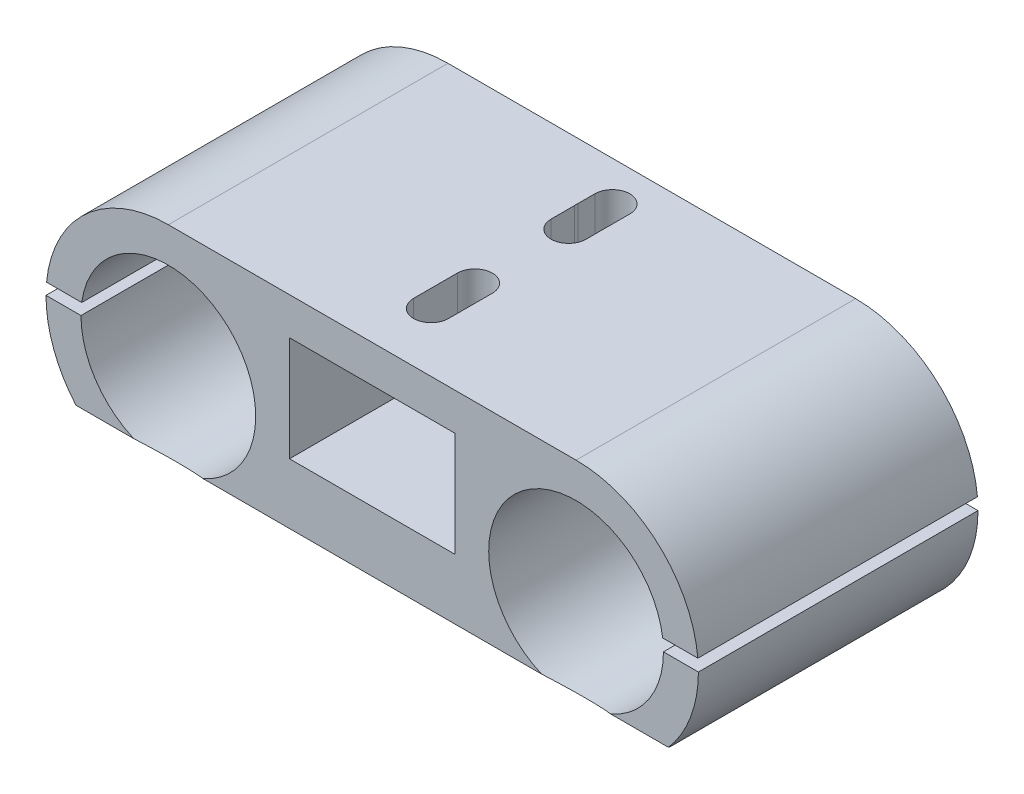
ISO-10303-21;
HEADER;
FILE_DESCRIPTION(('STEP AP214'),'2;1');
FILE_NAME('part.step','',(''),(''),'','','');
FILE_SCHEMA(('AUTOMOTIVE_DESIGN { 1 0 10303 214 1 1 1 1 }'));
ENDSEC;
DATA;
#1=APPLICATION_CONTEXT('core data for automotive mechanical design processes');
#2=APPLICATION_PROTOCOL_DEFINITION('international standard','automotive_design',2000,#1);
#3=PRODUCT_CONTEXT('',#1,'mechanical');
#4=PRODUCT('Part','Part','',(#3));
#5=PRODUCT_RELATED_PRODUCT_CATEGORY('part','',(#4));
#6=PRODUCT_DEFINITION_FORMATION('','',#4);
#7=PRODUCT_DEFINITION_CONTEXT('part definition',#1,'design');
#8=PRODUCT_DEFINITION('design','',#6,#7);
#9=PRODUCT_DEFINITION_SHAPE('','',#8);
#10=(LENGTH_UNIT() NAMED_UNIT(*) SI_UNIT(.MILLI.,.METRE.));
#11=(NAMED_UNIT(*) PLANE_ANGLE_UNIT() SI_UNIT($,.RADIAN.));
#12=(NAMED_UNIT(*) SI_UNIT($,.STERADIAN.) SOLID_ANGLE_UNIT());
#13=UNCERTAINTY_MEASURE_WITH_UNIT(LENGTH_MEASURE(1.E-05),#10,'distance_accuracy_value','');
#14=(GEOMETRIC_REPRESENTATION_CONTEXT(3) GLOBAL_UNCERTAINTY_ASSIGNED_CONTEXT((#13)) GLOBAL_UNIT_ASSIGNED_CONTEXT((#10,
#11,#12)) REPRESENTATION_CONTEXT('',''));
#15=CARTESIAN_POINT('',(0.,0.,0.));
#16=DIRECTION('',(0.,0.,1.));
#17=DIRECTION('',(1.,0.,0.));
#18=AXIS2_PLACEMENT_3D('',#15,#16,#17);
#19=CARTESIAN_POINT('',(-17.5,4.76713304517022,24.));
#20=DIRECTION('',(0.,0.,1.));
#21=DIRECTION('',(1.,0.,0.));
#22=AXIS2_PLACEMENT_3D('',#19,#20,#21);
#23=PLANE('',#22);
#24=DIRECTION('',(0.,-1.,0.));
#25=VECTOR('',#24,1.);
#26=CARTESIAN_POINT('',(7.1,3.06713304517023,24.));
#27=LINE('',#26,#25);
#28=CARTESIAN_POINT('',(7.1,12.0671330451702,24.));
#29=VERTEX_POINT('',#28);
#30=CARTESIAN_POINT('',(7.1,3.06713304517023,24.));
#31=VERTEX_POINT('',#30);
#32=EDGE_CURVE('E442',#29,#31,#27,.T.);
#33=ORIENTED_EDGE('',*,*,#32,.T.);
#34=DIRECTION('',(-1.,0.,0.));
#35=VECTOR('',#34,1.);
#36=CARTESIAN_POINT('',(7.1,3.06713304517023,24.));
#37=LINE('',#36,#35);
#38=CARTESIAN_POINT('',(-7.1,3.06713304517023,24.));
#39=VERTEX_POINT('',#38);
#40=EDGE_CURVE('E446',#31,#39,#37,.T.);
#41=ORIENTED_EDGE('',*,*,#40,.T.);
#42=DIRECTION('',(0.,1.,0.));
#43=VECTOR('',#42,1.);
#44=CARTESIAN_POINT('',(-7.1,3.06713304517023,24.));
#45=LINE('',#44,#43);
#46=CARTESIAN_POINT('',(-7.1,12.0671330451702,24.));
#47=VERTEX_POINT('',#46);
#48=EDGE_CURVE('E451',#39,#47,#45,.T.);
#49=ORIENTED_EDGE('',*,*,#48,.T.);
#50=DIRECTION('',(1.,0.,0.));
#51=VECTOR('',#50,1.);
#52=CARTESIAN_POINT('',(7.1,12.0671330451702,24.));
#53=LINE('',#52,#51);
#54=EDGE_CURVE('E455',#47,#29,#53,.T.);
#55=ORIENTED_EDGE('',*,*,#54,.T.);
#56=EDGE_LOOP('',(#33,#41,#49,#55));
#57=FACE_BOUND('',#56,.T.);
#58=CARTESIAN_POINT('',(-17.5,4.76713304517022,24.));
#59=DIRECTION('',(0.,0.,1.));
#60=DIRECTION('',(1.,0.,0.));
#61=AXIS2_PLACEMENT_3D('',#58,#59,#60);
#62=CIRCLE('',#61,10.5);
#63=CARTESIAN_POINT('',(-17.5,15.2671330451702,24.));
#64=VERTEX_POINT('',#63);
#65=CARTESIAN_POINT('',(-27.9522724801834,5.76713304517022,24.));
#66=VERTEX_POINT('',#65);
#67=EDGE_CURVE('E274',#64,#66,#62,.T.);
#68=ORIENTED_EDGE('',*,*,#67,.T.);
#69=DIRECTION('',(1.,0.,0.));
#70=VECTOR('',#69,1.);
#71=CARTESIAN_POINT('',(-17.5,5.76713304517022,24.));
#72=LINE('',#71,#70);
#73=CARTESIAN_POINT('',(-24.9330343736593,5.76713304517022,24.));
#74=VERTEX_POINT('',#73);
#75=EDGE_CURVE('E242',#66,#74,#72,.T.);
#76=ORIENTED_EDGE('',*,*,#75,.T.);
#77=CARTESIAN_POINT('',(-17.5,4.76713304517022,24.));
#78=DIRECTION('',(0.,0.,1.));
#79=DIRECTION('',(1.,0.,0.));
#80=AXIS2_PLACEMENT_3D('',#77,#78,#79);
#81=CIRCLE('',#80,7.5);
#82=CARTESIAN_POINT('',(-14.5281179815317,-2.11893384880522,24.));
#83=VERTEX_POINT('',#82);
#84=EDGE_CURVE('E253',#83,#74,#81,.T.);
#85=ORIENTED_EDGE('',*,*,#84,.F.);
#86=DIRECTION('',(-1.,0.,0.));
#87=VECTOR('',#86,1.);
#88=CARTESIAN_POINT('',(-17.5,-2.11893384880522,24.));
#89=LINE('',#88,#87);
#90=CARTESIAN_POINT('',(14.5281179815316,-2.11893384880522,24.));
#91=VERTEX_POINT('',#90);
#92=EDGE_CURVE('E430',#91,#83,#89,.T.);
#93=ORIENTED_EDGE('',*,*,#92,.F.);
#94=CARTESIAN_POINT('',(17.5,4.76713304517022,24.));
#95=DIRECTION('',(0.,0.,1.));
#96=DIRECTION('',(1.,0.,0.));
#97=AXIS2_PLACEMENT_3D('',#94,#95,#96);
#98=CIRCLE('',#97,7.50000000000001);
#99=CARTESIAN_POINT('',(24.9330343736593,5.76713304517022,24.));
#100=VERTEX_POINT('',#99);
#101=EDGE_CURVE('E270',#100,#91,#98,.T.);
#102=ORIENTED_EDGE('',*,*,#101,.F.);
#103=DIRECTION('',(-1.,0.,0.));
#104=VECTOR('',#103,1.);
#105=CARTESIAN_POINT('',(-17.5,5.76713304517022,24.));
#106=LINE('',#105,#104);
#107=CARTESIAN_POINT('',(27.9522724801834,5.76713304517022,24.));
#108=VERTEX_POINT('',#107);
#109=EDGE_CURVE('E399',#108,#100,#106,.T.);
#110=ORIENTED_EDGE('',*,*,#109,.F.);
#111=CARTESIAN_POINT('',(17.5,4.76713304517022,24.));
#112=DIRECTION('',(0.,0.,1.));
#113=DIRECTION('',(1.,0.,0.));
#114=AXIS2_PLACEMENT_3D('',#111,#112,#113);
#115=CIRCLE('',#114,10.5);
#116=CARTESIAN_POINT('',(17.5,15.2671330451702,24.));
#117=VERTEX_POINT('',#116);
#118=EDGE_CURVE('E278',#108,#117,#115,.T.);
#119=ORIENTED_EDGE('',*,*,#118,.T.);
#120=DIRECTION('',(-1.,0.,0.));
#121=VECTOR('',#120,1.);
#122=CARTESIAN_POINT('',(17.5,15.2671330451702,24.));
#123=LINE('',#122,#121);
#124=EDGE_CURVE('E284',#117,#64,#123,.T.);
#125=ORIENTED_EDGE('',*,*,#124,.T.);
#126=EDGE_LOOP('',(#68,#76,#85,#93,#102,#110,#119,#125));
#127=FACE_BOUND('',#126,.T.);
#128=ADVANCED_FACE('F42',(#57,#127),#23,.T.);
#129=CARTESIAN_POINT('',(-25.,4.76713304517022,24.));
#130=VERTEX_POINT('',#129);
#131=CARTESIAN_POINT('',(-20.4718820184683,-2.11893384880522,24.));
#132=VERTEX_POINT('',#131);
#133=EDGE_CURVE('E263',#130,#132,#81,.T.);
#134=ORIENTED_EDGE('',*,*,#133,.F.);
#135=DIRECTION('',(-1.,0.,0.));
#136=VECTOR('',#135,1.);
#137=CARTESIAN_POINT('',(-17.5,4.76713304517022,24.));
#138=LINE('',#137,#136);
#139=CARTESIAN_POINT('',(-28.,4.76713304517022,24.));
#140=VERTEX_POINT('',#139);
#141=EDGE_CURVE('E379',#130,#140,#138,.T.);
#142=ORIENTED_EDGE('',*,*,#141,.T.);
#143=CARTESIAN_POINT('',(-25.4266690817578,-2.11893384880522,24.));
#144=VERTEX_POINT('',#143);
#145=EDGE_CURVE('E279',#140,#144,#62,.T.);
#146=ORIENTED_EDGE('',*,*,#145,.T.);
#147=EDGE_CURVE('E425',#132,#144,#89,.T.);
#148=ORIENTED_EDGE('',*,*,#147,.F.);
#149=EDGE_LOOP('',(#134,#142,#146,#148));
#150=FACE_BOUND('',#149,.T.);
#151=ADVANCED_FACE('F543',(#150),#23,.T.);
#152=CARTESIAN_POINT('',(-17.5,4.76713304517022,0.));
#153=DIRECTION('',(0.,0.,1.));
#154=DIRECTION('',(1.,0.,0.));
#155=AXIS2_PLACEMENT_3D('',#152,#153,#154);
#156=PLANE('',#155);
#157=DIRECTION('',(-1.,0.,0.));
#158=VECTOR('',#157,1.);
#159=CARTESIAN_POINT('',(7.1,3.06713304517023,0.));
#160=LINE('',#159,#158);
#161=CARTESIAN_POINT('',(7.1,3.06713304517023,0.));
#162=VERTEX_POINT('',#161);
#163=CARTESIAN_POINT('',(-7.1,3.06713304517023,0.));
#164=VERTEX_POINT('',#163);
#165=EDGE_CURVE('E462',#162,#164,#160,.T.);
#166=ORIENTED_EDGE('',*,*,#165,.F.);
#167=DIRECTION('',(0.,-1.,0.));
#168=VECTOR('',#167,1.);
#169=CARTESIAN_POINT('',(7.1,3.06713304517023,0.));
#170=LINE('',#169,#168);
#171=CARTESIAN_POINT('',(7.1,12.0671330451702,0.));
#172=VERTEX_POINT('',#171);
#173=EDGE_CURVE('E315',#172,#162,#170,.T.);
#174=ORIENTED_EDGE('',*,*,#173,.F.);
#175=DIRECTION('',(1.,0.,0.));
#176=VECTOR('',#175,1.);
#177=CARTESIAN_POINT('',(7.1,12.0671330451702,0.));
#178=LINE('',#177,#176);
#179=CARTESIAN_POINT('',(-7.1,12.0671330451702,0.));
#180=VERTEX_POINT('',#179);
#181=EDGE_CURVE('E447',#180,#172,#178,.T.);
#182=ORIENTED_EDGE('',*,*,#181,.F.);
#183=DIRECTION('',(0.,1.,0.));
#184=VECTOR('',#183,1.);
#185=CARTESIAN_POINT('',(-7.1,3.06713304517023,0.));
#186=LINE('',#185,#184);
#187=EDGE_CURVE('E466',#164,#180,#186,.T.);
#188=ORIENTED_EDGE('',*,*,#187,.F.);
#189=EDGE_LOOP('',(#166,#174,#182,#188));
#190=FACE_BOUND('',#189,.T.);
#191=DIRECTION('',(1.,0.,0.));
#192=VECTOR('',#191,1.);
#193=CARTESIAN_POINT('',(-17.5,5.76713304517022,0.));
#194=LINE('',#193,#192);
#195=CARTESIAN_POINT('',(-27.9522724801834,5.76713304517022,0.));
#196=VERTEX_POINT('',#195);
#197=CARTESIAN_POINT('',(-24.9330343736593,5.76713304517022,0.));
#198=VERTEX_POINT('',#197);
#199=EDGE_CURVE('E230',#196,#198,#194,.T.);
#200=ORIENTED_EDGE('',*,*,#199,.F.);
#201=CARTESIAN_POINT('',(-17.5,4.76713304517022,0.));
#202=DIRECTION('',(0.,0.,1.));
#203=DIRECTION('',(1.,0.,0.));
#204=AXIS2_PLACEMENT_3D('',#201,#202,#203);
#205=CIRCLE('',#204,10.5);
#206=CARTESIAN_POINT('',(-17.5,15.2671330451702,0.));
#207=VERTEX_POINT('',#206);
#208=EDGE_CURVE('E288',#207,#196,#205,.T.);
#209=ORIENTED_EDGE('',*,*,#208,.F.);
#210=DIRECTION('',(-1.,0.,0.));
#211=VECTOR('',#210,1.);
#212=CARTESIAN_POINT('',(17.5,15.2671330451702,0.));
#213=LINE('',#212,#211);
#214=CARTESIAN_POINT('',(17.5,15.2671330451702,0.));
#215=VERTEX_POINT('',#214);
#216=EDGE_CURVE('E297',#215,#207,#213,.T.);
#217=ORIENTED_EDGE('',*,*,#216,.F.);
#218=CARTESIAN_POINT('',(17.5,4.76713304517022,0.));
#219=DIRECTION('',(0.,0.,1.));
#220=DIRECTION('',(1.,0.,0.));
#221=AXIS2_PLACEMENT_3D('',#218,#219,#220);
#222=CIRCLE('',#221,10.5);
#223=CARTESIAN_POINT('',(27.9522724801834,5.76713304517022,0.));
#224=VERTEX_POINT('',#223);
#225=EDGE_CURVE('E291',#224,#215,#222,.T.);
#226=ORIENTED_EDGE('',*,*,#225,.F.);
#227=DIRECTION('',(-1.,0.,0.));
#228=VECTOR('',#227,1.);
#229=CARTESIAN_POINT('',(-17.5,5.76713304517022,0.));
#230=LINE('',#229,#228);
#231=CARTESIAN_POINT('',(24.9330343736593,5.76713304517022,0.));
#232=VERTEX_POINT('',#231);
#233=EDGE_CURVE('E395',#224,#232,#230,.T.);
#234=ORIENTED_EDGE('',*,*,#233,.T.);
#235=CARTESIAN_POINT('',(17.5,4.76713304517022,0.));
#236=DIRECTION('',(0.,0.,1.));
#237=DIRECTION('',(1.,0.,0.));
#238=AXIS2_PLACEMENT_3D('',#235,#236,#237);
#239=CIRCLE('',#238,7.50000000000001);
#240=CARTESIAN_POINT('',(25.,4.76713304517022,0.));
#241=VERTEX_POINT('',#240);
#242=EDGE_CURVE('E492',#232,#241,#239,.T.);
#243=ORIENTED_EDGE('',*,*,#242,.T.);
#244=DIRECTION('',(1.,0.,0.));
#245=VECTOR('',#244,1.);
#246=CARTESIAN_POINT('',(-17.5,4.76713304517022,0.));
#247=LINE('',#246,#245);
#248=CARTESIAN_POINT('',(28.,4.76713304517022,0.));
#249=VERTEX_POINT('',#248);
#250=EDGE_CURVE('E406',#241,#249,#247,.T.);
#251=ORIENTED_EDGE('',*,*,#250,.T.);
#252=CARTESIAN_POINT('',(21.9721359549996,-4.73286695482977,0.));
#253=VERTEX_POINT('',#252);
#254=EDGE_CURVE('E293',#253,#249,#222,.T.);
#255=ORIENTED_EDGE('',*,*,#254,.F.);
#256=DIRECTION('',(-1.,0.,0.));
#257=VECTOR('',#256,1.);
#258=CARTESIAN_POINT('',(-17.5,-4.73286695482977,0.));
#259=LINE('',#258,#257);
#260=CARTESIAN_POINT('',(-21.9721359549996,-4.73286695482977,0.));
#261=VERTEX_POINT('',#260);
#262=EDGE_CURVE('E476',#253,#261,#259,.T.);
#263=ORIENTED_EDGE('',*,*,#262,.T.);
#264=CARTESIAN_POINT('',(-28.,4.76713304517022,0.));
#265=VERTEX_POINT('',#264);
#266=EDGE_CURVE('E292',#265,#261,#205,.T.);
#267=ORIENTED_EDGE('',*,*,#266,.F.);
#268=DIRECTION('',(-1.,0.,0.));
#269=VECTOR('',#268,1.);
#270=CARTESIAN_POINT('',(-17.5,4.76713304517022,0.));
#271=LINE('',#270,#269);
#272=CARTESIAN_POINT('',(-25.,4.76713304517022,0.));
#273=VERTEX_POINT('',#272);
#274=EDGE_CURVE('E261',#273,#265,#271,.T.);
#275=ORIENTED_EDGE('',*,*,#274,.F.);
#276=CARTESIAN_POINT('',(-17.5,4.76713304517022,0.));
#277=DIRECTION('',(0.,0.,1.));
#278=DIRECTION('',(1.,0.,0.));
#279=AXIS2_PLACEMENT_3D('',#276,#277,#278);
#280=CIRCLE('',#279,7.5);
#281=EDGE_CURVE('E250',#273,#198,#280,.T.);
#282=ORIENTED_EDGE('',*,*,#281,.T.);
#283=EDGE_LOOP('',(#200,#209,#217,#226,#234,#243,#251,#255,#263,#267,#275,#282));
#284=FACE_BOUND('',#283,.T.);
#285=ADVANCED_FACE('F259',(#190,#284),#156,.F.);
#286=CARTESIAN_POINT('',(-17.5,4.76713304517022,24.));
#287=DIRECTION('',(0.,0.,-1.));
#288=DIRECTION('',(-1.,0.,0.));
#289=AXIS2_PLACEMENT_3D('',#286,#287,#288);
#290=CYLINDRICAL_SURFACE('',#289,10.5);
#291=DIRECTION('',(0.,0.,-1.));
#292=VECTOR('',#291,1.);
#293=CARTESIAN_POINT('',(-27.9522724801834,5.76713304517022,24.));
#294=LINE('',#293,#292);
#295=EDGE_CURVE('E236',#66,#196,#294,.T.);
#296=ORIENTED_EDGE('',*,*,#295,.F.);
#297=ORIENTED_EDGE('',*,*,#67,.F.);
#298=DIRECTION('',(0.,0.,-1.));
#299=VECTOR('',#298,1.);
#300=CARTESIAN_POINT('',(-17.5,15.2671330451702,24.));
#301=LINE('',#300,#299);
#302=EDGE_CURVE('E287',#64,#207,#301,.T.);
#303=ORIENTED_EDGE('',*,*,#302,.T.);
#304=ORIENTED_EDGE('',*,*,#208,.T.);
#305=EDGE_LOOP('',(#296,#297,#303,#304));
#306=FACE_BOUND('',#305,.T.);
#307=ADVANCED_FACE('F44',(#306),#290,.T.);
#308=DIRECTION('',(0.,0.,-1.));
#309=VECTOR('',#308,1.);
#310=CARTESIAN_POINT('',(-28.,4.76713304517022,24.));
#311=LINE('',#310,#309);
#312=EDGE_CURVE('E243',#265,#140,#311,.F.);
#313=ORIENTED_EDGE('',*,*,#312,.F.);
#314=ORIENTED_EDGE('',*,*,#266,.T.);
#315=DIRECTION('',(0.,0.,-1.));
#316=VECTOR('',#315,1.);
#317=CARTESIAN_POINT('',(-21.9721359549996,-4.73286695482977,24.));
#318=LINE('',#317,#316);
#319=CARTESIAN_POINT('',(-21.9721359549996,-4.73286695482977,20.9464810931033));
#320=VERTEX_POINT('',#319);
#321=EDGE_CURVE('E489',#261,#320,#318,.F.);
#322=ORIENTED_EDGE('',*,*,#321,.T.);
#323=CARTESIAN_POINT('',(-17.5,4.76713304517022,32.0440985297012));
#324=DIRECTION('',(0.,0.759670574273656,-0.650308095123176));
#325=DIRECTION('',(0.,-0.650308095123176,-0.759670574273656));
#326=AXIS2_PLACEMENT_3D('',#323,#324,#325);
#327=ELLIPSE('',#326,16.1461929795156,10.5);
#328=EDGE_CURVE('E421',#320,#144,#327,.T.);
#329=ORIENTED_EDGE('',*,*,#328,.T.);
#330=ORIENTED_EDGE('',*,*,#145,.F.);
#331=EDGE_LOOP('',(#313,#314,#322,#329,#330));
#332=FACE_BOUND('',#331,.T.);
#333=ADVANCED_FACE('F516',(#332),#290,.T.);
#334=CARTESIAN_POINT('',(-17.5,4.76713304517022,24.));
#335=DIRECTION('',(0.,0.,-1.));
#336=DIRECTION('',(-1.,0.,0.));
#337=AXIS2_PLACEMENT_3D('',#334,#335,#336);
#338=CYLINDRICAL_SURFACE('',#337,7.5);
#339=ORIENTED_EDGE('',*,*,#84,.T.);
#340=DIRECTION('',(0.,0.,-1.));
#341=VECTOR('',#340,1.);
#342=CARTESIAN_POINT('',(-24.9330343736593,5.76713304517022,24.));
#343=LINE('',#342,#341);
#344=EDGE_CURVE('E233',#74,#198,#343,.T.);
#345=ORIENTED_EDGE('',*,*,#344,.T.);
#346=ORIENTED_EDGE('',*,*,#281,.F.);
#347=DIRECTION('',(0.,0.,-1.));
#348=VECTOR('',#347,1.);
#349=CARTESIAN_POINT('',(-25.,4.76713304517022,24.));
#350=LINE('',#349,#348);
#351=EDGE_CURVE('E256',#273,#130,#350,.F.);
#352=ORIENTED_EDGE('',*,*,#351,.T.);
#353=ORIENTED_EDGE('',*,*,#133,.T.);
#354=CARTESIAN_POINT('',(-17.5,4.76713304517022,32.0440985297012));
#355=DIRECTION('',(0.,0.759670574273656,-0.650308095123176));
#356=DIRECTION('',(0.,-0.650308095123176,-0.759670574273656));
#357=AXIS2_PLACEMENT_3D('',#354,#355,#356);
#358=ELLIPSE('',#357,11.5329949853683,7.5);
#359=EDGE_CURVE('E435',#83,#132,#358,.T.);
#360=ORIENTED_EDGE('',*,*,#359,.F.);
#361=EDGE_LOOP('',(#339,#345,#346,#352,#353,#360));
#362=FACE_BOUND('',#361,.T.);
#363=ADVANCED_FACE('F248',(#362),#338,.F.);
#364=DIRECTION('',(1.,0.,0.));
#365=VECTOR('',#364,1.);
#366=CARTESIAN_POINT('',(-17.5,4.76713304517022,24.));
#367=LINE('',#366,#365);
#368=CARTESIAN_POINT('',(25.,4.76713304517022,24.));
#369=VERTEX_POINT('',#368);
#370=CARTESIAN_POINT('',(28.,4.76713304517022,24.));
#371=VERTEX_POINT('',#370);
#372=EDGE_CURVE('E410',#369,#371,#367,.T.);
#373=ORIENTED_EDGE('',*,*,#372,.F.);
#374=CARTESIAN_POINT('',(20.4718820184684,-2.11893384880522,24.));
#375=VERTEX_POINT('',#374);
#376=EDGE_CURVE('E264',#375,#369,#98,.T.);
#377=ORIENTED_EDGE('',*,*,#376,.F.);
#378=CARTESIAN_POINT('',(25.4266690817578,-2.11893384880522,24.));
#379=VERTEX_POINT('',#378);
#380=EDGE_CURVE('E429',#379,#375,#89,.T.);
#381=ORIENTED_EDGE('',*,*,#380,.F.);
#382=EDGE_CURVE('E280',#379,#371,#115,.T.);
#383=ORIENTED_EDGE('',*,*,#382,.T.);
#384=EDGE_LOOP('',(#373,#377,#381,#383));
#385=FACE_BOUND('',#384,.T.);
#386=ADVANCED_FACE('F528',(#385),#23,.T.);
#387=CARTESIAN_POINT('',(17.5,4.76713304517022,24.));
#388=DIRECTION('',(0.,0.,-1.));
#389=DIRECTION('',(-1.,0.,0.));
#390=AXIS2_PLACEMENT_3D('',#387,#388,#389);
#391=CYLINDRICAL_SURFACE('',#390,10.5);
#392=ORIENTED_EDGE('',*,*,#254,.T.);
#393=DIRECTION('',(0.,0.,-1.));
#394=VECTOR('',#393,1.);
#395=CARTESIAN_POINT('',(28.,4.76713304517022,24.));
#396=LINE('',#395,#394);
#397=EDGE_CURVE('E413',#249,#371,#396,.F.);
#398=ORIENTED_EDGE('',*,*,#397,.T.);
#399=ORIENTED_EDGE('',*,*,#382,.F.);
#400=CARTESIAN_POINT('',(17.5,4.76713304517022,32.0440985297012));
#401=DIRECTION('',(0.,0.759670574273656,-0.650308095123176));
#402=DIRECTION('',(0.,-0.650308095123176,-0.759670574273656));
#403=AXIS2_PLACEMENT_3D('',#400,#401,#402);
#404=ELLIPSE('',#403,16.1461929795156,10.5);
#405=CARTESIAN_POINT('',(21.9721359549996,-4.73286695482977,20.9464810931033));
#406=VERTEX_POINT('',#405);
#407=EDGE_CURVE('E417',#379,#406,#404,.T.);
#408=ORIENTED_EDGE('',*,*,#407,.T.);
#409=DIRECTION('',(0.,0.,-1.));
#410=VECTOR('',#409,1.);
#411=CARTESIAN_POINT('',(21.9721359549996,-4.73286695482977,24.));
#412=LINE('',#411,#410);
#413=EDGE_CURVE('E307',#406,#253,#412,.T.);
#414=ORIENTED_EDGE('',*,*,#413,.T.);
#415=EDGE_LOOP('',(#392,#398,#399,#408,#414));
#416=FACE_BOUND('',#415,.T.);
#417=ADVANCED_FACE('F524',(#416),#391,.T.);
#418=ORIENTED_EDGE('',*,*,#118,.F.);
#419=DIRECTION('',(0.,0.,-1.));
#420=VECTOR('',#419,1.);
#421=CARTESIAN_POINT('',(27.9522724801834,5.76713304517022,24.));
#422=LINE('',#421,#420);
#423=EDGE_CURVE('E402',#108,#224,#422,.T.);
#424=ORIENTED_EDGE('',*,*,#423,.T.);
#425=ORIENTED_EDGE('',*,*,#225,.T.);
#426=DIRECTION('',(0.,0.,-1.));
#427=VECTOR('',#426,1.);
#428=CARTESIAN_POINT('',(17.5,15.2671330451702,24.));
#429=LINE('',#428,#427);
#430=EDGE_CURVE('E303',#117,#215,#429,.T.);
#431=ORIENTED_EDGE('',*,*,#430,.F.);
#432=EDGE_LOOP('',(#418,#424,#425,#431));
#433=FACE_BOUND('',#432,.T.);
#434=ADVANCED_FACE('F557',(#433),#391,.T.);
#435=CARTESIAN_POINT('',(17.5,15.2671330451702,24.));
#436=DIRECTION('',(0.,-1.,0.));
#437=DIRECTION('',(0.,0.,-1.));
#438=AXIS2_PLACEMENT_3D('',#435,#436,#437);
#439=PLANE('',#438);
#440=CARTESIAN_POINT('',(0.00758060641771474,15.2671330451702,7.14975753905439));
#441=DIRECTION('',(0.,1.,0.));
#442=DIRECTION('',(0.,0.,1.));
#443=AXIS2_PLACEMENT_3D('',#440,#441,#442);
#444=CIRCLE('',#443,1.5);
#445=CARTESIAN_POINT('',(-1.49241939358229,15.2671330451702,7.14975753905439));
#446=VERTEX_POINT('',#445);
#447=CARTESIAN_POINT('',(1.50758060641771,15.2671330451702,7.14975753905439));
#448=VERTEX_POINT('',#447);
#449=EDGE_CURVE('E369',#446,#448,#444,.T.);
#450=ORIENTED_EDGE('',*,*,#449,.F.);
#451=DIRECTION('',(0.,0.,-1.));
#452=VECTOR('',#451,1.);
#453=CARTESIAN_POINT('',(-1.49241939358229,15.2671330451702,24.));
#454=LINE('',#453,#452);
#455=CARTESIAN_POINT('',(-1.49241939358229,15.2671330451702,5.15061325857801));
#456=VERTEX_POINT('',#455);
#457=EDGE_CURVE('E356',#446,#456,#454,.T.);
#458=ORIENTED_EDGE('',*,*,#457,.T.);
#459=CARTESIAN_POINT('',(0.,15.2671330451702,5.));
#460=DIRECTION('',(0.,1.,0.));
#461=DIRECTION('',(0.,0.,1.));
#462=AXIS2_PLACEMENT_3D('',#459,#460,#461);
#463=CIRCLE('',#462,1.5);
#464=CARTESIAN_POINT('',(-1.49241939358229,15.2671330451702,4.849386741422));
#465=VERTEX_POINT('',#464);
#466=EDGE_CURVE('E316',#465,#456,#463,.T.);
#467=ORIENTED_EDGE('',*,*,#466,.F.);
#468=CARTESIAN_POINT('',(-1.49241939358229,15.2671330451702,3.39431838847826));
#469=VERTEX_POINT('',#468);
#470=EDGE_CURVE('E350',#465,#469,#454,.T.);
#471=ORIENTED_EDGE('',*,*,#470,.T.);
#472=CARTESIAN_POINT('',(0.00758060641771474,15.2671330451702,3.39431838847826));
#473=DIRECTION('',(0.,1.,0.));
#474=DIRECTION('',(0.,0.,1.));
#475=AXIS2_PLACEMENT_3D('',#472,#473,#474);
#476=CIRCLE('',#475,1.5);
#477=CARTESIAN_POINT('',(1.50758060641771,15.2671330451702,3.39431838847826));
#478=VERTEX_POINT('',#477);
#479=EDGE_CURVE('E366',#478,#469,#476,.T.);
#480=ORIENTED_EDGE('',*,*,#479,.F.);
#481=DIRECTION('',(0.,0.,-1.));
#482=VECTOR('',#481,1.);
#483=CARTESIAN_POINT('',(1.50758060641771,15.2671330451702,7.14975753905439));
#484=LINE('',#483,#482);
#485=EDGE_CURVE('E363',#448,#478,#484,.T.);
#486=ORIENTED_EDGE('',*,*,#485,.F.);
#487=EDGE_LOOP('',(#450,#458,#467,#471,#480,#486));
#488=FACE_BOUND('',#487,.T.);
#489=DIRECTION('',(0.,0.,1.));
#490=VECTOR('',#489,1.);
#491=CARTESIAN_POINT('',(1.5,15.2671330451702,24.));
#492=LINE('',#491,#490);
#493=CARTESIAN_POINT('',(1.5,15.2671330451702,15.1891532474464));
#494=VERTEX_POINT('',#493);
#495=CARTESIAN_POINT('',(1.5,15.2671330451702,18.9445923980225));
#496=VERTEX_POINT('',#495);
#497=EDGE_CURVE('E60',#494,#496,#492,.T.);
#498=ORIENTED_EDGE('',*,*,#497,.T.);
#499=CARTESIAN_POINT('',(0.,15.2671330451702,18.9445923980225));
#500=DIRECTION('',(0.,1.,0.));
#501=DIRECTION('',(0.,0.,1.));
#502=AXIS2_PLACEMENT_3D('',#499,#500,#501);
#503=CIRCLE('',#502,1.5);
#504=CARTESIAN_POINT('',(-1.5,15.2671330451702,18.9445923980225));
#505=VERTEX_POINT('',#504);
#506=EDGE_CURVE('E46',#505,#496,#503,.T.);
#507=ORIENTED_EDGE('',*,*,#506,.F.);
#508=DIRECTION('',(0.,0.,-1.));
#509=VECTOR('',#508,1.);
#510=CARTESIAN_POINT('',(-1.5,15.2671330451702,24.));
#511=LINE('',#510,#509);
#512=CARTESIAN_POINT('',(-1.5,15.2671330451702,15.1891532474464));
#513=VERTEX_POINT('',#512);
#514=EDGE_CURVE('E105',#505,#513,#511,.T.);
#515=ORIENTED_EDGE('',*,*,#514,.T.);
#516=CARTESIAN_POINT('',(0.,15.2671330451702,15.1891532474464));
#517=DIRECTION('',(0.,1.,0.));
#518=DIRECTION('',(0.,0.,1.));
#519=AXIS2_PLACEMENT_3D('',#516,#517,#518);
#520=CIRCLE('',#519,1.5);
#521=EDGE_CURVE('E371',#494,#513,#520,.T.);
#522=ORIENTED_EDGE('',*,*,#521,.F.);
#523=EDGE_LOOP('',(#498,#507,#515,#522));
#524=FACE_BOUND('',#523,.T.);
#525=ORIENTED_EDGE('',*,*,#216,.T.);
#526=ORIENTED_EDGE('',*,*,#302,.F.);
#527=ORIENTED_EDGE('',*,*,#124,.F.);
#528=ORIENTED_EDGE('',*,*,#430,.T.);
#529=EDGE_LOOP('',(#525,#526,#527,#528));
#530=FACE_BOUND('',#529,.T.);
#531=ADVANCED_FACE('F566',(#488,#524,#530),#439,.F.);
#532=CARTESIAN_POINT('',(17.5,4.76713304517022,24.));
#533=DIRECTION('',(0.,0.,-1.));
#534=DIRECTION('',(-1.,0.,0.));
#535=AXIS2_PLACEMENT_3D('',#532,#533,#534);
#536=CYLINDRICAL_SURFACE('',#535,7.50000000000001);
#537=DIRECTION('',(0.,0.,-1.));
#538=VECTOR('',#537,1.);
#539=CARTESIAN_POINT('',(25.,4.76713304517022,24.));
#540=LINE('',#539,#538);
#541=EDGE_CURVE('E323',#241,#369,#540,.F.);
#542=ORIENTED_EDGE('',*,*,#541,.F.);
#543=ORIENTED_EDGE('',*,*,#242,.F.);
#544=DIRECTION('',(0.,0.,-1.));
#545=VECTOR('',#544,1.);
#546=CARTESIAN_POINT('',(24.9330343736593,5.76713304517022,24.));
#547=LINE('',#546,#545);
#548=EDGE_CURVE('E320',#100,#232,#547,.T.);
#549=ORIENTED_EDGE('',*,*,#548,.F.);
#550=ORIENTED_EDGE('',*,*,#101,.T.);
#551=CARTESIAN_POINT('',(17.5,4.76713304517022,32.0440985297012));
#552=DIRECTION('',(0.,0.759670574273656,-0.650308095123176));
#553=DIRECTION('',(0.,-0.650308095123176,-0.759670574273656));
#554=AXIS2_PLACEMENT_3D('',#551,#552,#553);
#555=ELLIPSE('',#554,11.5329949853683,7.50000000000001);
#556=EDGE_CURVE('E431',#375,#91,#555,.T.);
#557=ORIENTED_EDGE('',*,*,#556,.F.);
#558=ORIENTED_EDGE('',*,*,#376,.T.);
#559=EDGE_LOOP('',(#542,#543,#549,#550,#557,#558));
#560=FACE_BOUND('',#559,.T.);
#561=ADVANCED_FACE('F502',(#560),#536,.F.);
#562=CARTESIAN_POINT('',(40.1580418455376,-4.73286695482977,24.));
#563=DIRECTION('',(0.,1.,0.));
#564=DIRECTION('',(0.,0.,1.));
#565=AXIS2_PLACEMENT_3D('',#562,#563,#564);
#566=PLANE('',#565);
#567=ORIENTED_EDGE('',*,*,#413,.F.);
#568=DIRECTION('',(-1.,0.,0.));
#569=VECTOR('',#568,1.);
#570=CARTESIAN_POINT('',(40.1580418455376,-4.73286695482977,20.9464810931033));
#571=LINE('',#570,#569);
#572=EDGE_CURVE('E310',#406,#320,#571,.T.);
#573=ORIENTED_EDGE('',*,*,#572,.T.);
#574=ORIENTED_EDGE('',*,*,#321,.F.);
#575=ORIENTED_EDGE('',*,*,#262,.F.);
#576=EDGE_LOOP('',(#567,#573,#574,#575));
#577=FACE_BOUND('',#576,.T.);
#578=ADVANCED_FACE('F521',(#577),#566,.F.);
#579=CARTESIAN_POINT('',(7.1,3.06713304517023,24.));
#580=DIRECTION('',(1.,0.,0.));
#581=DIRECTION('',(0.,0.,-1.));
#582=AXIS2_PLACEMENT_3D('',#579,#580,#581);
#583=PLANE('',#582);
#584=ORIENTED_EDGE('',*,*,#173,.T.);
#585=DIRECTION('',(0.,0.,-1.));
#586=VECTOR('',#585,1.);
#587=CARTESIAN_POINT('',(7.1,3.06713304517023,24.));
#588=LINE('',#587,#586);
#589=EDGE_CURVE('E459',#31,#162,#588,.T.);
#590=ORIENTED_EDGE('',*,*,#589,.F.);
#591=ORIENTED_EDGE('',*,*,#32,.F.);
#592=DIRECTION('',(0.,0.,-1.));
#593=VECTOR('',#592,1.);
#594=CARTESIAN_POINT('',(7.1,12.0671330451702,24.));
#595=LINE('',#594,#593);
#596=EDGE_CURVE('E473',#29,#172,#595,.T.);
#597=ORIENTED_EDGE('',*,*,#596,.T.);
#598=EDGE_LOOP('',(#584,#590,#591,#597));
#599=FACE_BOUND('',#598,.T.);
#600=ADVANCED_FACE('F569',(#599),#583,.F.);
#601=CARTESIAN_POINT('',(7.1,12.0671330451702,24.));
#602=DIRECTION('',(0.,1.,0.));
#603=DIRECTION('',(0.,0.,1.));
#604=AXIS2_PLACEMENT_3D('',#601,#602,#603);
#605=PLANE('',#604);
#606=CARTESIAN_POINT('',(0.,12.0671330451702,5.));
#607=DIRECTION('',(0.,1.,0.));
#608=DIRECTION('',(0.,0.,1.));
#609=AXIS2_PLACEMENT_3D('',#606,#607,#608);
#610=CIRCLE('',#609,1.5);
#611=CARTESIAN_POINT('',(-1.49241939358229,12.0671330451702,4.849386741422));
#612=VERTEX_POINT('',#611);
#613=CARTESIAN_POINT('',(-1.49241939358229,12.0671330451702,5.15061325857801));
#614=VERTEX_POINT('',#613);
#615=EDGE_CURVE('E311',#612,#614,#610,.T.);
#616=ORIENTED_EDGE('',*,*,#615,.T.);
#617=DIRECTION('',(0.,0.,1.));
#618=VECTOR('',#617,1.);
#619=CARTESIAN_POINT('',(-1.49241939358228,12.0671330451702,24.));
#620=LINE('',#619,#618);
#621=CARTESIAN_POINT('',(-1.49241939358229,12.0671330451702,7.14975753905439));
#622=VERTEX_POINT('',#621);
#623=EDGE_CURVE('E354',#614,#622,#620,.T.);
#624=ORIENTED_EDGE('',*,*,#623,.T.);
#625=CARTESIAN_POINT('',(0.00758060641771474,12.0671330451702,7.14975753905439));
#626=DIRECTION('',(0.,1.,0.));
#627=DIRECTION('',(0.,0.,1.));
#628=AXIS2_PLACEMENT_3D('',#625,#626,#627);
#629=CIRCLE('',#628,1.5);
#630=CARTESIAN_POINT('',(1.50758060641771,12.0671330451702,7.14975753905439));
#631=VERTEX_POINT('',#630);
#632=EDGE_CURVE('E343',#622,#631,#629,.T.);
#633=ORIENTED_EDGE('',*,*,#632,.T.);
#634=DIRECTION('',(0.,0.,-1.));
#635=VECTOR('',#634,1.);
#636=CARTESIAN_POINT('',(1.50758060641771,12.0671330451702,24.));
#637=LINE('',#636,#635);
#638=CARTESIAN_POINT('',(1.50758060641771,12.0671330451702,3.39431838847826));
#639=VERTEX_POINT('',#638);
#640=EDGE_CURVE('E335',#631,#639,#637,.T.);
#641=ORIENTED_EDGE('',*,*,#640,.T.);
#642=CARTESIAN_POINT('',(0.00758060641771474,12.0671330451702,3.39431838847826));
#643=DIRECTION('',(0.,1.,0.));
#644=DIRECTION('',(0.,0.,1.));
#645=AXIS2_PLACEMENT_3D('',#642,#643,#644);
#646=CIRCLE('',#645,1.5);
#647=CARTESIAN_POINT('',(-1.49241939358229,12.0671330451702,3.39431838847826));
#648=VERTEX_POINT('',#647);
#649=EDGE_CURVE('E339',#639,#648,#646,.T.);
#650=ORIENTED_EDGE('',*,*,#649,.T.);
#651=EDGE_CURVE('E355',#648,#612,#620,.T.);
#652=ORIENTED_EDGE('',*,*,#651,.T.);
#653=EDGE_LOOP('',(#616,#624,#633,#641,#650,#652));
#654=FACE_BOUND('',#653,.T.);
#655=CARTESIAN_POINT('',(0.,12.0671330451702,15.1891532474464));
#656=DIRECTION('',(0.,1.,0.));
#657=DIRECTION('',(0.,0.,1.));
#658=AXIS2_PLACEMENT_3D('',#655,#656,#657);
#659=CIRCLE('',#658,1.5);
#660=CARTESIAN_POINT('',(1.5,12.0671330451702,15.1891532474464));
#661=VERTEX_POINT('',#660);
#662=CARTESIAN_POINT('',(-1.5,12.0671330451702,15.1891532474464));
#663=VERTEX_POINT('',#662);
#664=EDGE_CURVE('E52',#661,#663,#659,.T.);
#665=ORIENTED_EDGE('',*,*,#664,.T.);
#666=DIRECTION('',(0.,0.,1.));
#667=VECTOR('',#666,1.);
#668=CARTESIAN_POINT('',(-1.5,12.0671330451702,24.));
#669=LINE('',#668,#667);
#670=CARTESIAN_POINT('',(-1.5,12.0671330451702,18.9445923980225));
#671=VERTEX_POINT('',#670);
#672=EDGE_CURVE('E359',#663,#671,#669,.T.);
#673=ORIENTED_EDGE('',*,*,#672,.T.);
#674=CARTESIAN_POINT('',(0.,12.0671330451702,18.9445923980225));
#675=DIRECTION('',(0.,1.,0.));
#676=DIRECTION('',(0.,0.,1.));
#677=AXIS2_PLACEMENT_3D('',#674,#675,#676);
#678=CIRCLE('',#677,1.5);
#679=CARTESIAN_POINT('',(1.5,12.0671330451702,18.9445923980225));
#680=VERTEX_POINT('',#679);
#681=EDGE_CURVE('E11',#671,#680,#678,.T.);
#682=ORIENTED_EDGE('',*,*,#681,.T.);
#683=DIRECTION('',(0.,0.,-1.));
#684=VECTOR('',#683,1.);
#685=CARTESIAN_POINT('',(1.5,12.0671330451702,24.));
#686=LINE('',#685,#684);
#687=EDGE_CURVE('E360',#680,#661,#686,.T.);
#688=ORIENTED_EDGE('',*,*,#687,.T.);
#689=EDGE_LOOP('',(#665,#673,#682,#688));
#690=FACE_BOUND('',#689,.T.);
#691=ORIENTED_EDGE('',*,*,#181,.T.);
#692=ORIENTED_EDGE('',*,*,#596,.F.);
#693=ORIENTED_EDGE('',*,*,#54,.F.);
#694=DIRECTION('',(0.,0.,-1.));
#695=VECTOR('',#694,1.);
#696=CARTESIAN_POINT('',(-7.1,12.0671330451702,24.));
#697=LINE('',#696,#695);
#698=EDGE_CURVE('E477',#47,#180,#697,.T.);
#699=ORIENTED_EDGE('',*,*,#698,.T.);
#700=EDGE_LOOP('',(#691,#692,#693,#699));
#701=FACE_BOUND('',#700,.T.);
#702=ADVANCED_FACE('F572',(#654,#690,#701),#605,.F.);
#703=CARTESIAN_POINT('',(-7.1,3.06713304517023,24.));
#704=DIRECTION('',(-1.,0.,0.));
#705=DIRECTION('',(0.,-1.,0.));
#706=AXIS2_PLACEMENT_3D('',#703,#704,#705);
#707=PLANE('',#706);
#708=ORIENTED_EDGE('',*,*,#187,.T.);
#709=ORIENTED_EDGE('',*,*,#698,.F.);
#710=ORIENTED_EDGE('',*,*,#48,.F.);
#711=DIRECTION('',(0.,0.,-1.));
#712=VECTOR('',#711,1.);
#713=CARTESIAN_POINT('',(-7.1,3.06713304517023,24.));
#714=LINE('',#713,#712);
#715=EDGE_CURVE('E480',#39,#164,#714,.T.);
#716=ORIENTED_EDGE('',*,*,#715,.T.);
#717=EDGE_LOOP('',(#708,#709,#710,#716));
#718=FACE_BOUND('',#717,.T.);
#719=ADVANCED_FACE('F578',(#718),#707,.F.);
#720=CARTESIAN_POINT('',(7.1,3.06713304517023,24.));
#721=DIRECTION('',(0.,-1.,0.));
#722=DIRECTION('',(1.,0.,0.));
#723=AXIS2_PLACEMENT_3D('',#720,#721,#722);
#724=PLANE('',#723);
#725=ORIENTED_EDGE('',*,*,#165,.T.);
#726=ORIENTED_EDGE('',*,*,#715,.F.);
#727=ORIENTED_EDGE('',*,*,#40,.F.);
#728=ORIENTED_EDGE('',*,*,#589,.T.);
#729=EDGE_LOOP('',(#725,#726,#727,#728));
#730=FACE_BOUND('',#729,.T.);
#731=ADVANCED_FACE('F574',(#730),#724,.F.);
#732=CARTESIAN_POINT('',(0.,8.26713304517022,5.));
#733=DIRECTION('',(0.,1.,0.));
#734=DIRECTION('',(0.,0.,1.));
#735=AXIS2_PLACEMENT_3D('',#732,#733,#734);
#736=CYLINDRICAL_SURFACE('',#735,1.5);
#737=ORIENTED_EDGE('',*,*,#466,.T.);
#738=DIRECTION('',(0.,1.,0.));
#739=VECTOR('',#738,1.);
#740=CARTESIAN_POINT('',(-1.49241939358229,8.26713304517022,5.15061325857801));
#741=LINE('',#740,#739);
#742=EDGE_CURVE('E331',#456,#614,#741,.F.);
#743=ORIENTED_EDGE('',*,*,#742,.T.);
#744=ORIENTED_EDGE('',*,*,#615,.F.);
#745=DIRECTION('',(0.,1.,0.));
#746=VECTOR('',#745,1.);
#747=CARTESIAN_POINT('',(-1.49241939358229,8.26713304517022,4.849386741422));
#748=LINE('',#747,#746);
#749=EDGE_CURVE('E255',#612,#465,#748,.T.);
#750=ORIENTED_EDGE('',*,*,#749,.T.);
#751=EDGE_LOOP('',(#737,#743,#744,#750));
#752=FACE_BOUND('',#751,.T.);
#753=ADVANCED_FACE('F577',(#752),#736,.F.);
#754=CARTESIAN_POINT('',(-28.,0.,26.4752754976314));
#755=DIRECTION('',(0.,0.759670574273656,-0.650308095123176));
#756=DIRECTION('',(0.,0.650308095123176,0.759670574273656));
#757=AXIS2_PLACEMENT_3D('',#754,#755,#756);
#758=PLANE('',#757);
#759=ORIENTED_EDGE('',*,*,#92,.T.);
#760=ORIENTED_EDGE('',*,*,#359,.T.);
#761=ORIENTED_EDGE('',*,*,#147,.T.);
#762=ORIENTED_EDGE('',*,*,#328,.F.);
#763=ORIENTED_EDGE('',*,*,#572,.F.);
#764=ORIENTED_EDGE('',*,*,#407,.F.);
#765=ORIENTED_EDGE('',*,*,#380,.T.);
#766=ORIENTED_EDGE('',*,*,#556,.T.);
#767=EDGE_LOOP('',(#759,#760,#761,#762,#763,#764,#765,#766));
#768=FACE_BOUND('',#767,.T.);
#769=ADVANCED_FACE('F508',(#768),#758,.F.);
#770=CARTESIAN_POINT('',(20.,5.76713304517022,29.5516298047058));
#771=DIRECTION('',(0.,1.,0.));
#772=DIRECTION('',(0.,0.,1.));
#773=AXIS2_PLACEMENT_3D('',#770,#771,#772);
#774=PLANE('',#773);
#775=ORIENTED_EDGE('',*,*,#109,.T.);
#776=ORIENTED_EDGE('',*,*,#548,.T.);
#777=ORIENTED_EDGE('',*,*,#233,.F.);
#778=ORIENTED_EDGE('',*,*,#423,.F.);
#779=EDGE_LOOP('',(#775,#776,#777,#778));
#780=FACE_BOUND('',#779,.T.);
#781=ADVANCED_FACE('F533',(#780),#774,.F.);
#782=CARTESIAN_POINT('',(20.,4.76713304517022,29.5516298047058));
#783=DIRECTION('',(0.,-1.,0.));
#784=DIRECTION('',(0.,0.,-1.));
#785=AXIS2_PLACEMENT_3D('',#782,#783,#784);
#786=PLANE('',#785);
#787=ORIENTED_EDGE('',*,*,#250,.F.);
#788=ORIENTED_EDGE('',*,*,#541,.T.);
#789=ORIENTED_EDGE('',*,*,#372,.T.);
#790=ORIENTED_EDGE('',*,*,#397,.F.);
#791=EDGE_LOOP('',(#787,#788,#789,#790));
#792=FACE_BOUND('',#791,.T.);
#793=ADVANCED_FACE('F530',(#792),#786,.F.);
#794=CARTESIAN_POINT('',(-20.,4.76713304517022,29.5516298047058));
#795=DIRECTION('',(0.,1.,0.));
#796=DIRECTION('',(0.,0.,1.));
#797=AXIS2_PLACEMENT_3D('',#794,#795,#796);
#798=PLANE('',#797);
#799=ORIENTED_EDGE('',*,*,#312,.T.);
#800=ORIENTED_EDGE('',*,*,#141,.F.);
#801=ORIENTED_EDGE('',*,*,#351,.F.);
#802=ORIENTED_EDGE('',*,*,#274,.T.);
#803=EDGE_LOOP('',(#799,#800,#801,#802));
#804=FACE_BOUND('',#803,.T.);
#805=ADVANCED_FACE('F532',(#804),#798,.T.);
#806=CARTESIAN_POINT('',(-20.,5.76713304517022,29.5516298047058));
#807=DIRECTION('',(0.,-1.,0.));
#808=DIRECTION('',(0.,0.,-1.));
#809=AXIS2_PLACEMENT_3D('',#806,#807,#808);
#810=PLANE('',#809);
#811=ORIENTED_EDGE('',*,*,#295,.T.);
#812=ORIENTED_EDGE('',*,*,#199,.T.);
#813=ORIENTED_EDGE('',*,*,#344,.F.);
#814=ORIENTED_EDGE('',*,*,#75,.F.);
#815=EDGE_LOOP('',(#811,#812,#813,#814));
#816=FACE_BOUND('',#815,.T.);
#817=ADVANCED_FACE('F232',(#816),#810,.T.);
#818=CARTESIAN_POINT('',(0.00758060641771474,9.26713304517022,7.14975753905439));
#819=DIRECTION('',(0.,1.,0.));
#820=DIRECTION('',(0.,0.,1.));
#821=AXIS2_PLACEMENT_3D('',#818,#819,#820);
#822=CYLINDRICAL_SURFACE('',#821,1.5);
#823=DIRECTION('',(0.,1.,0.));
#824=VECTOR('',#823,1.);
#825=CARTESIAN_POINT('',(1.50758060641771,9.26713304517022,7.14975753905439));
#826=LINE('',#825,#824);
#827=EDGE_CURVE('E893',#631,#448,#826,.T.);
#828=ORIENTED_EDGE('',*,*,#827,.F.);
#829=ORIENTED_EDGE('',*,*,#632,.F.);
#830=DIRECTION('',(0.,1.,0.));
#831=VECTOR('',#830,1.);
#832=CARTESIAN_POINT('',(-1.49241939358229,9.26713304517022,7.14975753905439));
#833=LINE('',#832,#831);
#834=EDGE_CURVE('E895',#622,#446,#833,.T.);
#835=ORIENTED_EDGE('',*,*,#834,.T.);
#836=ORIENTED_EDGE('',*,*,#449,.T.);
#837=EDGE_LOOP('',(#828,#829,#835,#836));
#838=FACE_BOUND('',#837,.T.);
#839=ADVANCED_FACE('F683',(#838),#822,.F.);
#840=CARTESIAN_POINT('',(0.00758060641771474,9.26713304517022,3.39431838847826));
#841=DIRECTION('',(0.,1.,0.));
#842=DIRECTION('',(0.,0.,1.));
#843=AXIS2_PLACEMENT_3D('',#840,#841,#842);
#844=CYLINDRICAL_SURFACE('',#843,1.5);
#845=DIRECTION('',(0.,1.,0.));
#846=VECTOR('',#845,1.);
#847=CARTESIAN_POINT('',(-1.49241939358229,9.26713304517022,3.39431838847826));
#848=LINE('',#847,#846);
#849=EDGE_CURVE('E905',#648,#469,#848,.T.);
#850=ORIENTED_EDGE('',*,*,#849,.F.);
#851=ORIENTED_EDGE('',*,*,#649,.F.);
#852=DIRECTION('',(0.,1.,0.));
#853=VECTOR('',#852,1.);
#854=CARTESIAN_POINT('',(1.50758060641771,9.26713304517022,3.39431838847826));
#855=LINE('',#854,#853);
#856=EDGE_CURVE('E900',#639,#478,#855,.T.);
#857=ORIENTED_EDGE('',*,*,#856,.T.);
#858=ORIENTED_EDGE('',*,*,#479,.T.);
#859=EDGE_LOOP('',(#850,#851,#857,#858));
#860=FACE_BOUND('',#859,.T.);
#861=ADVANCED_FACE('F692',(#860),#844,.F.);
#862=CARTESIAN_POINT('',(1.50758060641771,9.26713304517022,7.14975753905439));
#863=DIRECTION('',(1.,0.,0.));
#864=DIRECTION('',(0.,0.,-1.));
#865=AXIS2_PLACEMENT_3D('',#862,#863,#864);
#866=PLANE('',#865);
#867=ORIENTED_EDGE('',*,*,#856,.F.);
#868=ORIENTED_EDGE('',*,*,#640,.F.);
#869=ORIENTED_EDGE('',*,*,#827,.T.);
#870=ORIENTED_EDGE('',*,*,#485,.T.);
#871=EDGE_LOOP('',(#867,#868,#869,#870));
#872=FACE_BOUND('',#871,.T.);
#873=ADVANCED_FACE('F702',(#872),#866,.F.);
#874=CARTESIAN_POINT('',(-1.49241939358229,9.26713304517022,7.14975753905439));
#875=DIRECTION('',(-1.,0.,0.));
#876=DIRECTION('',(0.,0.,1.));
#877=AXIS2_PLACEMENT_3D('',#874,#875,#876);
#878=PLANE('',#877);
#879=ORIENTED_EDGE('',*,*,#834,.F.);
#880=ORIENTED_EDGE('',*,*,#623,.F.);
#881=ORIENTED_EDGE('',*,*,#742,.F.);
#882=ORIENTED_EDGE('',*,*,#457,.F.);
#883=EDGE_LOOP('',(#879,#880,#881,#882));
#884=FACE_BOUND('',#883,.T.);
#885=ADVANCED_FACE('F712',(#884),#878,.F.);
#886=ORIENTED_EDGE('',*,*,#749,.F.);
#887=ORIENTED_EDGE('',*,*,#651,.F.);
#888=ORIENTED_EDGE('',*,*,#849,.T.);
#889=ORIENTED_EDGE('',*,*,#470,.F.);
#890=EDGE_LOOP('',(#886,#887,#888,#889));
#891=FACE_BOUND('',#890,.T.);
#892=ADVANCED_FACE('F722',(#891),#878,.F.);
#893=CARTESIAN_POINT('',(0.,9.26713304517022,18.9445923980225));
#894=DIRECTION('',(0.,1.,0.));
#895=DIRECTION('',(0.,0.,1.));
#896=AXIS2_PLACEMENT_3D('',#893,#894,#895);
#897=CYLINDRICAL_SURFACE('',#896,1.5);
#898=DIRECTION('',(0.,1.,0.));
#899=VECTOR('',#898,1.);
#900=CARTESIAN_POINT('',(1.5,9.26713304517022,18.9445923980225));
#901=LINE('',#900,#899);
#902=EDGE_CURVE('E899',#680,#496,#901,.T.);
#903=ORIENTED_EDGE('',*,*,#902,.F.);
#904=ORIENTED_EDGE('',*,*,#681,.F.);
#905=DIRECTION('',(0.,1.,0.));
#906=VECTOR('',#905,1.);
#907=CARTESIAN_POINT('',(-1.5,9.26713304517022,18.9445923980225));
#908=LINE('',#907,#906);
#909=EDGE_CURVE('E911',#671,#505,#908,.T.);
#910=ORIENTED_EDGE('',*,*,#909,.T.);
#911=ORIENTED_EDGE('',*,*,#506,.T.);
#912=EDGE_LOOP('',(#903,#904,#910,#911));
#913=FACE_BOUND('',#912,.T.);
#914=ADVANCED_FACE('F732',(#913),#897,.F.);
#915=CARTESIAN_POINT('',(0.,9.26713304517022,15.1891532474464));
#916=DIRECTION('',(0.,1.,0.));
#917=DIRECTION('',(0.,0.,1.));
#918=AXIS2_PLACEMENT_3D('',#915,#916,#917);
#919=CYLINDRICAL_SURFACE('',#918,1.5);
#920=DIRECTION('',(0.,1.,0.));
#921=VECTOR('',#920,1.);
#922=CARTESIAN_POINT('',(-1.5,9.26713304517022,15.1891532474464));
#923=LINE('',#922,#921);
#924=EDGE_CURVE('E935',#663,#513,#923,.T.);
#925=ORIENTED_EDGE('',*,*,#924,.F.);
#926=ORIENTED_EDGE('',*,*,#664,.F.);
#927=DIRECTION('',(0.,1.,0.));
#928=VECTOR('',#927,1.);
#929=CARTESIAN_POINT('',(1.5,9.26713304517022,15.1891532474464));
#930=LINE('',#929,#928);
#931=EDGE_CURVE('E68',#661,#494,#930,.T.);
#932=ORIENTED_EDGE('',*,*,#931,.T.);
#933=ORIENTED_EDGE('',*,*,#521,.T.);
#934=EDGE_LOOP('',(#925,#926,#932,#933));
#935=FACE_BOUND('',#934,.T.);
#936=ADVANCED_FACE('F741',(#935),#919,.F.);
#937=CARTESIAN_POINT('',(-1.5,9.26713304517022,18.9445923980225));
#938=DIRECTION('',(-1.,0.,0.));
#939=DIRECTION('',(0.,0.,1.));
#940=AXIS2_PLACEMENT_3D('',#937,#938,#939);
#941=PLANE('',#940);
#942=ORIENTED_EDGE('',*,*,#909,.F.);
#943=ORIENTED_EDGE('',*,*,#672,.F.);
#944=ORIENTED_EDGE('',*,*,#924,.T.);
#945=ORIENTED_EDGE('',*,*,#514,.F.);
#946=EDGE_LOOP('',(#942,#943,#944,#945));
#947=FACE_BOUND('',#946,.T.);
#948=ADVANCED_FACE('F750',(#947),#941,.F.);
#949=CARTESIAN_POINT('',(1.5,9.26713304517022,18.9445923980225));
#950=DIRECTION('',(1.,0.,0.));
#951=DIRECTION('',(0.,0.,-1.));
#952=AXIS2_PLACEMENT_3D('',#949,#950,#951);
#953=PLANE('',#952);
#954=ORIENTED_EDGE('',*,*,#931,.F.);
#955=ORIENTED_EDGE('',*,*,#687,.F.);
#956=ORIENTED_EDGE('',*,*,#902,.T.);
#957=ORIENTED_EDGE('',*,*,#497,.F.);
#958=EDGE_LOOP('',(#954,#955,#956,#957));
#959=FACE_BOUND('',#958,.T.);
#960=ADVANCED_FACE('F759',(#959),#953,.F.);
#961=CLOSED_SHELL('',(#128,#151,#285,#307,#333,#363,#386,#417,#434,#531,#561,#578,#600,#702,
#719,#731,#753,#769,#781,#793,#805,#817,#839,#861,#873,#885,#892,#914,#936,#948,#960));
#962=MANIFOLD_SOLID_BREP('B2',#961);
#963=ADVANCED_BREP_SHAPE_REPRESENTATION('',(#18,#962),#14);
#964=SHAPE_DEFINITION_REPRESENTATION(#9,#963);
ENDSEC;
END-ISO-10303-21;
